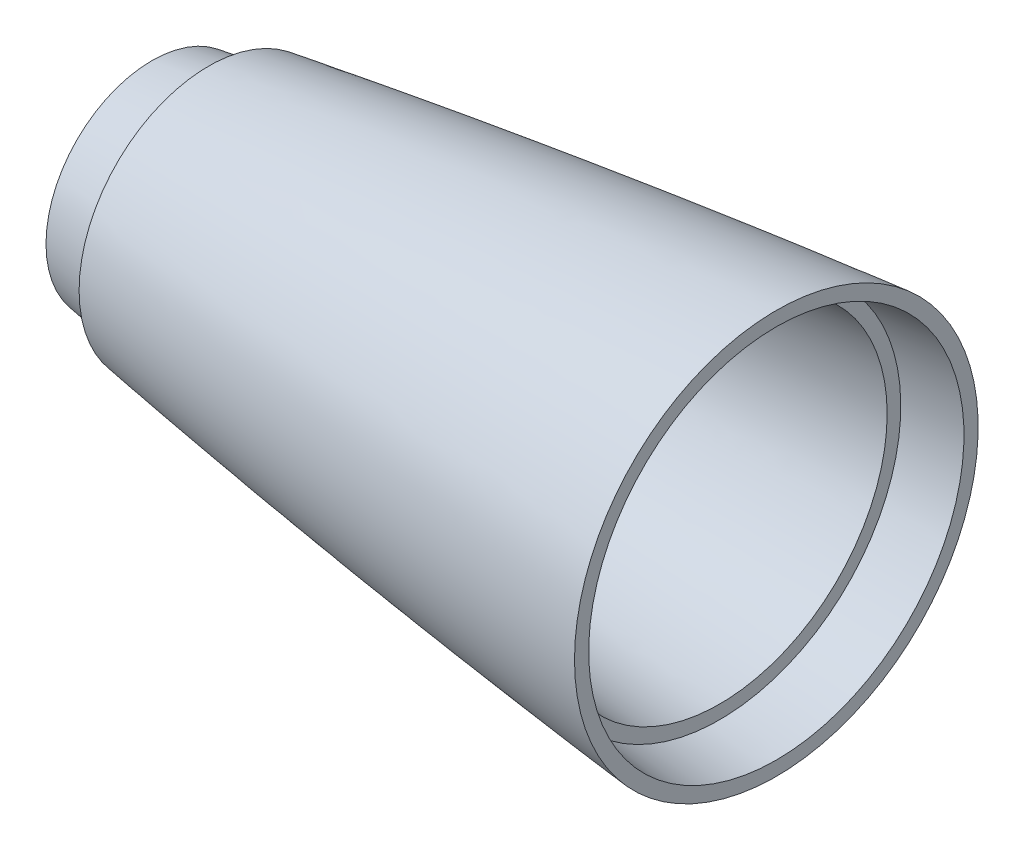
ISO-10303-21;
HEADER;
FILE_DESCRIPTION(('STEP AP214'),'2;1');
FILE_NAME('part.step','',(''),(''),'','','');
FILE_SCHEMA(('AUTOMOTIVE_DESIGN { 1 0 10303 214 1 1 1 1 }'));
ENDSEC;
DATA;
#1=APPLICATION_CONTEXT('core data for automotive mechanical design processes');
#2=APPLICATION_PROTOCOL_DEFINITION('international standard','automotive_design',2000,#1);
#3=PRODUCT_CONTEXT('',#1,'mechanical');
#4=PRODUCT('Part','Part','',(#3));
#5=PRODUCT_RELATED_PRODUCT_CATEGORY('part','',(#4));
#6=PRODUCT_DEFINITION_FORMATION('','',#4);
#7=PRODUCT_DEFINITION_CONTEXT('part definition',#1,'design');
#8=PRODUCT_DEFINITION('design','',#6,#7);
#9=PRODUCT_DEFINITION_SHAPE('','',#8);
#10=(LENGTH_UNIT() NAMED_UNIT(*) SI_UNIT(.MILLI.,.METRE.));
#11=(NAMED_UNIT(*) PLANE_ANGLE_UNIT() SI_UNIT($,.RADIAN.));
#12=(NAMED_UNIT(*) SI_UNIT($,.STERADIAN.) SOLID_ANGLE_UNIT());
#13=UNCERTAINTY_MEASURE_WITH_UNIT(LENGTH_MEASURE(1.E-05),#10,'distance_accuracy_value','');
#14=(GEOMETRIC_REPRESENTATION_CONTEXT(3) GLOBAL_UNCERTAINTY_ASSIGNED_CONTEXT((#13)) GLOBAL_UNIT_ASSIGNED_CONTEXT((#10,
#11,#12)) REPRESENTATION_CONTEXT('',''));
#15=CARTESIAN_POINT('',(0.,0.,0.));
#16=DIRECTION('',(0.,0.,1.));
#17=DIRECTION('',(1.,0.,0.));
#18=AXIS2_PLACEMENT_3D('',#15,#16,#17);
#19=CARTESIAN_POINT('',(180.00000000009,0.,-32.4452329875971));
#20=CARTESIAN_POINT('',(180.707921155786,0.,-32.561040811964));
#21=CARTESIAN_POINT('',(182.133261387228,0.,-32.7934976082339));
#22=CARTESIAN_POINT('',(185.481418731239,0.,-33.3380273321608));
#23=CARTESIAN_POINT('',(188.270654503431,0.,-33.7858784066682));
#24=CARTESIAN_POINT('',(192.010221309318,0.,-34.3850695967084));
#25=CARTESIAN_POINT('',(195.228206899192,0.,-34.8948689562992));
#26=CARTESIAN_POINT('',(199.570468356093,0.,-35.5794135852408));
#27=CARTESIAN_POINT('',(204.612118439555,0.,-36.3652858029114));
#28=CARTESIAN_POINT('',(210.599675101401,0.,-37.2880747385316));
#29=CARTESIAN_POINT('',(217.381527368302,0.,-38.3175038559458));
#30=CARTESIAN_POINT('',(224.199431830809,0.,-39.337962509517));
#31=CARTESIAN_POINT('',(231.000326384621,0.,-40.3410705398139));
#32=CARTESIAN_POINT('',(238.231352747696,0.,-41.3926669054146));
#33=CARTESIAN_POINT('',(247.161482906366,0.,-42.6713665589852));
#34=CARTESIAN_POINT('',(257.802887130334,0.,-44.1648294526104));
#35=CARTESIAN_POINT('',(270.150924061302,0.,-45.8552720726507));
#36=CARTESIAN_POINT('',(283.794359456414,0.,-47.6708375550897));
#37=CARTESIAN_POINT('',(295.737030889548,0.,-49.2152754588146));
#38=CARTESIAN_POINT('',(305.978190982954,0.,-50.5082703382672));
#39=CARTESIAN_POINT('',(314.514733263939,0.,-51.5652873729847));
#40=CARTESIAN_POINT('',(321.345519316192,0.,-52.3987302281482));
#41=CARTESIAN_POINT('',(329.886041018821,0.,-53.4253697411032));
#42=CARTESIAN_POINT('',(338.428416984608,0.,-54.4317945358532));
#43=CARTESIAN_POINT('',(346.974164985923,0.,-55.4182215630399));
#44=CARTESIAN_POINT('',(355.520607387531,0.,-56.3844049036155));
#45=CARTESIAN_POINT('',(362.361505913395,0.,-57.145531183986));
#46=CARTESIAN_POINT('',(369.198991401269,0.,-57.8941029668808));
#47=CARTESIAN_POINT('',(374.469220919394,0.,-58.461594844415));
#48=CARTESIAN_POINT('',(378.020206664483,0.,-58.8395911203162));
#49=CARTESIAN_POINT('',(379.865853594168,0.,-59.0348444512128));
#50=CARTESIAN_POINT('',(380.000000002138,0.,-59.0490295744395));
#51=(BOUNDED_CURVE() B_SPLINE_CURVE(4,(#19,#20,#21,#22,#23,#24,#25,#26,#27,#28,#29,#30,#31,#32,
#33,#34,#35,#36,#37,#38,#39,#40,#41,#42,#43,#44,#45,#46,#47,#48,#49,#50),.UNSPECIFIED.,.F.,
.F.) B_SPLINE_CURVE_WITH_KNOTS((5,1,1,1,1,1,1,1,1,1,1,1,1,1,1,1,1,1,1,1,1,1,1,1,1,1,1,1,5),
(0.0829985121463872,0.0959295754514534,0.10886063875652,0.121791701964223,0.134722765171927,
0.147653828261889,0.160584891351851,0.186447016458493,0.212309141763199,0.23817126710191,
0.264033393386435,0.289895519604363,0.315757645743918,0.347960161687557,0.399684412839016,
0.451408664755221,0.503132916084191,0.554857167038231,0.580719292918879,0.606581418799527,
0.632443544445992,0.658305670092456,0.710029921189334,0.735892047075735,0.761754172962135,
0.787616298438502,0.81347842391487,0.839340549799039,0.841367328089962),
.UNSPECIFIED.) CURVE() GEOMETRIC_REPRESENTATION_ITEM() RATIONAL_B_SPLINE_CURVE((1.,1.,1.,1.,1.,
1.,1.,1.,1.,1.,1.,1.,1.,1.,1.,1.,1.,1.,1.,1.,1.,1.,1.,1.,1.,1.,1.,1.,1.,1.,1.,1.)) REPRESENTATION_ITEM(''));
#52=CARTESIAN_POINT('',(200.000000001046,0.,-0.00109267931872048));
#53=DIRECTION('',(-1.,0.,0.));
#54=AXIS1_PLACEMENT('',#52,#53);
#55=SURFACE_OF_REVOLUTION('',#51,#54);
#56=CARTESIAN_POINT('',(180.00000000009,0.,-0.00109267931871681));
#57=DIRECTION('',(-1.,0.,0.));
#58=DIRECTION('',(0.,0.,1.));
#59=AXIS2_PLACEMENT_3D('',#56,#57,#58);
#60=CIRCLE('',#59,32.4441403082784);
#61=CARTESIAN_POINT('',(180.00000000009,0.,32.4430476289597));
#62=VERTEX_POINT('',#61);
#63=EDGE_CURVE('E19',#62,#62,#60,.T.);
#64=ORIENTED_EDGE('',*,*,#63,.T.);
#65=EDGE_LOOP('',(#64));
#66=FACE_BOUND('',#65,.T.);
#67=CARTESIAN_POINT('',(380.000000002144,0.,-0.00109267931875355));
#68=DIRECTION('',(-1.,0.,0.));
#69=DIRECTION('',(0.,0.,1.));
#70=AXIS2_PLACEMENT_3D('',#67,#68,#69);
#71=CIRCLE('',#70,59.0479368951214);
#72=CARTESIAN_POINT('',(380.000000002144,0.,59.0468442158026));
#73=VERTEX_POINT('',#72);
#74=EDGE_CURVE('E45',#73,#73,#71,.F.);
#75=ORIENTED_EDGE('',*,*,#74,.T.);
#76=EDGE_LOOP('',(#75));
#77=FACE_BOUND('',#76,.T.);
#78=ADVANCED_FACE('F15',(#66,#77),#55,.T.);
#79=CARTESIAN_POINT('',(180.00000000009,0.,-32.4452329875861));
#80=DIRECTION('',(1.,0.,0.));
#81=DIRECTION('',(0.,0.,-1.));
#82=AXIS2_PLACEMENT_3D('',#79,#80,#81);
#83=PLANE('',#82);
#84=CARTESIAN_POINT('',(179.999999999302,0.,-0.00109267931871364));
#85=DIRECTION('',(1.,0.,0.));
#86=DIRECTION('',(0.,1.,0.));
#87=AXIS2_PLACEMENT_3D('',#84,#85,#86);
#88=CIRCLE('',#87,37.3053813630746);
#89=CARTESIAN_POINT('',(179.999999999302,37.3053813630746,-0.00109267931871364));
#90=VERTEX_POINT('',#89);
#91=EDGE_CURVE('E43',#90,#90,#88,.T.);
#92=ORIENTED_EDGE('',*,*,#91,.F.);
#93=EDGE_LOOP('',(#92));
#94=FACE_BOUND('',#93,.T.);
#95=ORIENTED_EDGE('',*,*,#63,.F.);
#96=EDGE_LOOP('',(#95));
#97=FACE_BOUND('',#96,.T.);
#98=ADVANCED_FACE('F53',(#94,#97),#83,.F.);
#99=CARTESIAN_POINT('',(380.000000002144,0.,-59.04902957443));
#100=DIRECTION('',(-1.,0.,0.));
#101=DIRECTION('',(0.,0.,1.));
#102=AXIS2_PLACEMENT_3D('',#99,#100,#101);
#103=PLANE('',#102);
#104=ORIENTED_EDGE('',*,*,#74,.F.);
#105=EDGE_LOOP('',(#104));
#106=FACE_BOUND('',#105,.T.);
#107=CARTESIAN_POINT('',(380.000000001605,0.,-0.00109267931876211));
#108=DIRECTION('',(1.,0.,0.));
#109=DIRECTION('',(0.,1.,0.));
#110=AXIS2_PLACEMENT_3D('',#107,#108,#109);
#111=CIRCLE('',#110,63.8479368999382);
#112=CARTESIAN_POINT('',(380.000000001605,63.8479368999382,-0.00109267931876211));
#113=VERTEX_POINT('',#112);
#114=EDGE_CURVE('E40',#113,#113,#111,.T.);
#115=ORIENTED_EDGE('',*,*,#114,.T.);
#116=EDGE_LOOP('',(#115));
#117=FACE_BOUND('',#116,.T.);
#118=ADVANCED_FACE('F55',(#106,#117),#103,.F.);
#119=CARTESIAN_POINT('',(200.000000000248,0.,-0.00109267931872048));
#120=DIRECTION('',(1.,0.,0.));
#121=DIRECTION('',(0.,1.,0.));
#122=AXIS2_PLACEMENT_3D('',#119,#120,#121);
#123=CONICAL_SURFACE('',#122,40.5838805998692,0.1624798925);
#124=CARTESIAN_POINT('',(200.000000000248,0.,-0.00109267931872048));
#125=DIRECTION('',(1.,0.,0.));
#126=DIRECTION('',(0.,1.,0.));
#127=AXIS2_PLACEMENT_3D('',#124,#125,#126);
#128=CIRCLE('',#127,40.5838805998692);
#129=CARTESIAN_POINT('',(200.000000000248,40.5838805998692,-0.00109267931872048));
#130=VERTEX_POINT('',#129);
#131=EDGE_CURVE('E37',#130,#130,#128,.F.);
#132=ORIENTED_EDGE('',*,*,#131,.T.);
#133=EDGE_LOOP('',(#132));
#134=FACE_BOUND('',#133,.T.);
#135=ORIENTED_EDGE('',*,*,#91,.T.);
#136=EDGE_LOOP('',(#135));
#137=FACE_BOUND('',#136,.T.);
#138=ADVANCED_FACE('F62',(#134,#137),#123,.T.);
#139=CARTESIAN_POINT('',(400.000000000732,0.,-0.00109267931876211));
#140=DIRECTION('',(1.,0.,0.));
#141=DIRECTION('',(0.,1.,0.));
#142=AXIS2_PLACEMENT_3D('',#139,#140,#141);
#143=CONICAL_SURFACE('',#142,66.1110850417484,0.1126781057);
#144=ORIENTED_EDGE('',*,*,#114,.F.);
#145=EDGE_LOOP('',(#144));
#146=FACE_BOUND('',#145,.T.);
#147=CARTESIAN_POINT('',(400.000000000732,0.,-0.00109267931876211));
#148=DIRECTION('',(1.,0.,0.));
#149=DIRECTION('',(0.,1.,0.));
#150=AXIS2_PLACEMENT_3D('',#147,#148,#149);
#151=CIRCLE('',#150,66.1110850417484);
#152=CARTESIAN_POINT('',(400.000000000732,66.1110850417484,-0.00109267931876211));
#153=VERTEX_POINT('',#152);
#154=EDGE_CURVE('E28',#153,#153,#151,.T.);
#155=ORIENTED_EDGE('',*,*,#154,.T.);
#156=EDGE_LOOP('',(#155));
#157=FACE_BOUND('',#156,.T.);
#158=ADVANCED_FACE('F87',(#146,#157),#143,.F.);
#159=CARTESIAN_POINT('',(200.000000001107,0.,-45.6460659543187));
#160=DIRECTION('',(1.,0.,0.));
#161=DIRECTION('',(0.,0.,-1.));
#162=AXIS2_PLACEMENT_3D('',#159,#160,#161);
#163=PLANE('',#162);
#164=CARTESIAN_POINT('',(200.000000001107,0.,-0.00109267931872048));
#165=DIRECTION('',(-1.,0.,0.));
#166=DIRECTION('',(0.,0.,1.));
#167=AXIS2_PLACEMENT_3D('',#164,#165,#166);
#168=CIRCLE('',#167,45.6449732750095);
#169=CARTESIAN_POINT('',(200.000000001107,0.,45.6438805956908));
#170=VERTEX_POINT('',#169);
#171=EDGE_CURVE('E23',#170,#170,#168,.T.);
#172=ORIENTED_EDGE('',*,*,#171,.T.);
#173=EDGE_LOOP('',(#172));
#174=FACE_BOUND('',#173,.T.);
#175=ORIENTED_EDGE('',*,*,#131,.F.);
#176=EDGE_LOOP('',(#175));
#177=FACE_BOUND('',#176,.T.);
#178=ADVANCED_FACE('F74',(#174,#177),#163,.F.);
#179=CARTESIAN_POINT('',(400.000000001235,0.,-71.11217771572));
#180=DIRECTION('',(-1.,0.,0.));
#181=DIRECTION('',(0.,0.,1.));
#182=AXIS2_PLACEMENT_3D('',#179,#180,#181);
#183=PLANE('',#182);
#184=ORIENTED_EDGE('',*,*,#154,.F.);
#185=EDGE_LOOP('',(#184));
#186=FACE_BOUND('',#185,.T.);
#187=CARTESIAN_POINT('',(400.000000001235,0.,-0.00109267931875722));
#188=DIRECTION('',(-1.,0.,0.));
#189=DIRECTION('',(0.,0.,1.));
#190=AXIS2_PLACEMENT_3D('',#187,#188,#189);
#191=CIRCLE('',#190,71.1110850364454);
#192=CARTESIAN_POINT('',(400.000000001235,0.,71.1099923571267));
#193=VERTEX_POINT('',#192);
#194=EDGE_CURVE('E10',#193,#193,#191,.F.);
#195=ORIENTED_EDGE('',*,*,#194,.T.);
#196=EDGE_LOOP('',(#195));
#197=FACE_BOUND('',#196,.T.);
#198=ADVANCED_FACE('F68',(#186,#197),#183,.F.);
#199=CARTESIAN_POINT('',(400.000000001081,0.,-71.1121777157487));
#200=CARTESIAN_POINT('',(398.701581254335,0.,-70.9817579243424));
#201=CARTESIAN_POINT('',(396.773581479021,0.,-70.7868032480274));
#202=CARTESIAN_POINT('',(392.442271211738,0.,-70.3474315968401));
#203=CARTESIAN_POINT('',(388.627941121944,0.,-69.9526870492343));
#204=CARTESIAN_POINT('',(383.448829985873,0.,-69.4157268590587));
#205=CARTESIAN_POINT('',(378.339064764445,0.,-68.8754890464676));
#206=CARTESIAN_POINT('',(371.911556605488,0.,-68.188858915912));
#207=CARTESIAN_POINT('',(365.806663470021,0.,-67.5244925176116));
#208=CARTESIAN_POINT('',(359.515866932988,0.,-66.831338679906));
#209=CARTESIAN_POINT('',(353.336198583377,0.,-66.1392501597194));
#210=CARTESIAN_POINT('',(347.094607370388,0.,-65.430855814555));
#211=CARTESIAN_POINT('',(339.335279823879,0.,-64.5370404525181));
#212=CARTESIAN_POINT('',(331.555805265944,0.,-63.6243842975573));
#213=CARTESIAN_POINT('',(323.792269603302,0.,-62.6964703492644));
#214=CARTESIAN_POINT('',(314.469891181164,0.,-61.5620431102932));
#215=CARTESIAN_POINT('',(305.153895566459,0.,-60.4078519464778));
#216=CARTESIAN_POINT('',(294.28641385893,0.,-59.0314739150257));
#217=CARTESIAN_POINT('',(281.873112123251,0.,-57.4175191068617));
#218=CARTESIAN_POINT('',(270.681671418911,0.,-55.9242067148589));
#219=CARTESIAN_POINT('',(261.044868577969,0.,-54.6090676065749));
#220=CARTESIAN_POINT('',(252.962161885948,0.,-53.4858493525548));
#221=CARTESIAN_POINT('',(246.429257829231,0.,-52.5653255636487));
#222=CARTESIAN_POINT('',(240.235166394662,0.,-51.6812567698205));
#223=CARTESIAN_POINT('',(234.036555035346,0.,-50.7849410079845));
#224=CARTESIAN_POINT('',(227.850552699619,0.,-49.8788831057688));
#225=CARTESIAN_POINT('',(222.421345220236,0.,-49.0730795776794));
#226=CARTESIAN_POINT('',(217.797789873861,0.,-48.3795131721968));
#227=CARTESIAN_POINT('',(213.899145191466,0.,-47.7892652411986));
#228=CARTESIAN_POINT('',(210.866585898958,0.,-47.3274744231708));
#229=CARTESIAN_POINT('',(207.645585171468,0.,-46.8330572901571));
#230=CARTESIAN_POINT('',(204.834997968271,0.,-46.3996933288836));
#231=CARTESIAN_POINT('',(201.977366372003,0.,-45.9549512659454));
#232=CARTESIAN_POINT('',(200.644631189739,0.,-45.7469411490191));
#233=CARTESIAN_POINT('',(200.000000001168,0.,-45.6460659543378));
#234=(BOUNDED_CURVE() B_SPLINE_CURVE(4,(#199,#200,#201,#202,#203,#204,#205,#206,#207,#208,#209,
#210,#211,#212,#213,#214,#215,#216,#217,#218,#219,#220,#221,#222,#223,#224,#225,#226,#227,#228,
#229,#230,#231,#232,#233),.UNSPECIFIED.,.F.,.F.) B_SPLINE_CURVE_WITH_KNOTS((5,1,1,1,1,1,1,1,1,1,
1,1,1,1,1,1,1,1,1,1,1,1,1,1,1,1,1,1,1,1,1,5),(0.0829314973073835,0.108818333298088,
0.12176175129344,0.134705169288792,0.160592005718058,0.186478842147323,0.212365678238105,
0.238252514328886,0.264139350711,0.290026187093114,0.315913023304193,0.34179985951527,
0.393573531881461,0.419460368407407,0.445347204933353,0.497120876958912,0.548894549391689,
0.600668222246817,0.652441894716599,0.683906556571355,0.709793393071445,0.735680229652133,
0.761567065609818,0.787453901587938,0.813340737572467,0.839227573950642,0.852170992281684,
0.865114410612725,0.878057829008943,0.891001247405161,0.903944665896458,0.916888084387755),
.UNSPECIFIED.) CURVE() GEOMETRIC_REPRESENTATION_ITEM() RATIONAL_B_SPLINE_CURVE((1.,1.,1.,1.,1.,
1.,1.,1.,1.,1.,1.,1.,1.,1.,1.,1.,1.,1.,1.,1.,1.,1.,1.,1.,1.,1.,1.,1.,1.,1.,1.,1.,1.,1.,1.)) REPRESENTATION_ITEM(''));
#235=CARTESIAN_POINT('',(200.000000001046,0.,-0.00109267931872048));
#236=DIRECTION('',(-1.,0.,0.));
#237=AXIS1_PLACEMENT('',#235,#236);
#238=SURFACE_OF_REVOLUTION('',#234,#237);
#239=ORIENTED_EDGE('',*,*,#194,.F.);
#240=EDGE_LOOP('',(#239));
#241=FACE_BOUND('',#240,.T.);
#242=ORIENTED_EDGE('',*,*,#171,.F.);
#243=EDGE_LOOP('',(#242));
#244=FACE_BOUND('',#243,.T.);
#245=ADVANCED_FACE('F66',(#241,#244),#238,.T.);
#246=CLOSED_SHELL('',(#78,#98,#118,#138,#158,#178,#198,#245));
#247=MANIFOLD_SOLID_BREP('B1',#246);
#248=ADVANCED_BREP_SHAPE_REPRESENTATION('',(#18,#247),#14);
#249=SHAPE_DEFINITION_REPRESENTATION(#9,#248);
ENDSEC;
END-ISO-10303-21;
